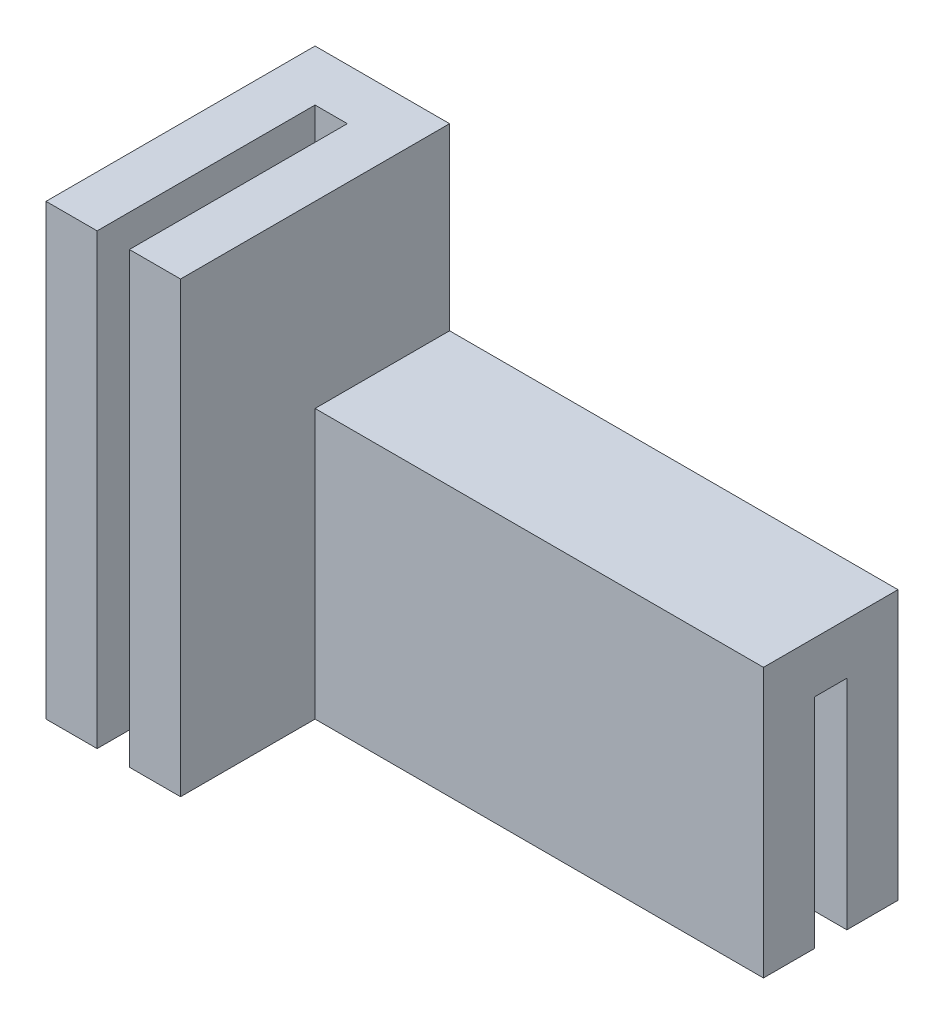
ISO-10303-21;
HEADER;
FILE_DESCRIPTION(('STEP AP214'),'2;1');
FILE_NAME('part.step','',(''),(''),'','','');
FILE_SCHEMA(('AUTOMOTIVE_DESIGN { 1 0 10303 214 1 1 1 1 }'));
ENDSEC;
DATA;
#1=APPLICATION_CONTEXT('core data for automotive mechanical design processes');
#2=APPLICATION_PROTOCOL_DEFINITION('international standard','automotive_design',2000,#1);
#3=PRODUCT_CONTEXT('',#1,'mechanical');
#4=PRODUCT('Part','Part','',(#3));
#5=PRODUCT_RELATED_PRODUCT_CATEGORY('part','',(#4));
#6=PRODUCT_DEFINITION_FORMATION('','',#4);
#7=PRODUCT_DEFINITION_CONTEXT('part definition',#1,'design');
#8=PRODUCT_DEFINITION('design','',#6,#7);
#9=PRODUCT_DEFINITION_SHAPE('','',#8);
#10=(LENGTH_UNIT() NAMED_UNIT(*) SI_UNIT(.MILLI.,.METRE.));
#11=(NAMED_UNIT(*) PLANE_ANGLE_UNIT() SI_UNIT($,.RADIAN.));
#12=(NAMED_UNIT(*) SI_UNIT($,.STERADIAN.) SOLID_ANGLE_UNIT());
#13=UNCERTAINTY_MEASURE_WITH_UNIT(LENGTH_MEASURE(1.E-05),#10,'distance_accuracy_value','');
#14=(GEOMETRIC_REPRESENTATION_CONTEXT(3) GLOBAL_UNCERTAINTY_ASSIGNED_CONTEXT((#13)) GLOBAL_UNIT_ASSIGNED_CONTEXT((#10,
#11,#12)) REPRESENTATION_CONTEXT('',''));
#15=CARTESIAN_POINT('',(0.,0.,0.));
#16=DIRECTION('',(0.,0.,1.));
#17=DIRECTION('',(1.,0.,0.));
#18=AXIS2_PLACEMENT_3D('',#15,#16,#17);
#19=CARTESIAN_POINT('',(15.,0.,30.));
#20=DIRECTION('',(-1.,0.,0.));
#21=DIRECTION('',(0.,-1.,0.));
#22=AXIS2_PLACEMENT_3D('',#19,#20,#21);
#23=PLANE('',#22);
#24=DIRECTION('',(0.,-1.,0.));
#25=VECTOR('',#24,1.);
#26=CARTESIAN_POINT('',(15.,-20.,15.));
#27=LINE('',#26,#25);
#28=CARTESIAN_POINT('',(15.,-20.,15.));
#29=VERTEX_POINT('',#28);
#30=CARTESIAN_POINT('',(15.,-50.,15.));
#31=VERTEX_POINT('',#30);
#32=EDGE_CURVE('E173',#29,#31,#27,.T.);
#33=ORIENTED_EDGE('',*,*,#32,.F.);
#34=DIRECTION('',(0.,0.,1.));
#35=VECTOR('',#34,1.);
#36=CARTESIAN_POINT('',(15.,-20.,0.));
#37=LINE('',#36,#35);
#38=CARTESIAN_POINT('',(15.,-20.,0.));
#39=VERTEX_POINT('',#38);
#40=EDGE_CURVE('E54',#39,#29,#37,.T.);
#41=ORIENTED_EDGE('',*,*,#40,.F.);
#42=DIRECTION('',(0.,1.,0.));
#43=VECTOR('',#42,1.);
#44=CARTESIAN_POINT('',(15.,0.,0.));
#45=LINE('',#44,#43);
#46=CARTESIAN_POINT('',(15.,0.,0.));
#47=VERTEX_POINT('',#46);
#48=EDGE_CURVE('E248',#39,#47,#45,.T.);
#49=ORIENTED_EDGE('',*,*,#48,.T.);
#50=DIRECTION('',(0.,0.,-1.));
#51=VECTOR('',#50,1.);
#52=CARTESIAN_POINT('',(15.,0.,30.));
#53=LINE('',#52,#51);
#54=CARTESIAN_POINT('',(15.,0.,30.));
#55=VERTEX_POINT('',#54);
#56=EDGE_CURVE('E253',#55,#47,#53,.T.);
#57=ORIENTED_EDGE('',*,*,#56,.F.);
#58=DIRECTION('',(0.,1.,0.));
#59=VECTOR('',#58,1.);
#60=CARTESIAN_POINT('',(15.,0.,30.));
#61=LINE('',#60,#59);
#62=CARTESIAN_POINT('',(15.,-50.,30.));
#63=VERTEX_POINT('',#62);
#64=EDGE_CURVE('E237',#63,#55,#61,.T.);
#65=ORIENTED_EDGE('',*,*,#64,.F.);
#66=DIRECTION('',(0.,0.,-1.));
#67=VECTOR('',#66,1.);
#68=CARTESIAN_POINT('',(15.,-50.,30.));
#69=LINE('',#68,#67);
#70=EDGE_CURVE('E42',#63,#31,#69,.T.);
#71=ORIENTED_EDGE('',*,*,#70,.T.);
#72=EDGE_LOOP('',(#33,#41,#49,#57,#65,#71));
#73=FACE_BOUND('',#72,.T.);
#74=ADVANCED_FACE('F34',(#73),#23,.F.);
#75=CARTESIAN_POINT('',(0.,0.,30.));
#76=DIRECTION('',(0.,0.,1.));
#77=DIRECTION('',(1.,0.,0.));
#78=AXIS2_PLACEMENT_3D('',#75,#76,#77);
#79=PLANE('',#78);
#80=DIRECTION('',(0.,-1.,0.));
#81=VECTOR('',#80,1.);
#82=CARTESIAN_POINT('',(5.7,0.,30.));
#83=LINE('',#82,#81);
#84=CARTESIAN_POINT('',(5.7,0.,30.));
#85=VERTEX_POINT('',#84);
#86=CARTESIAN_POINT('',(5.7,-50.,30.));
#87=VERTEX_POINT('',#86);
#88=EDGE_CURVE('E202',#85,#87,#83,.T.);
#89=ORIENTED_EDGE('',*,*,#88,.F.);
#90=DIRECTION('',(-1.,0.,0.));
#91=VECTOR('',#90,1.);
#92=CARTESIAN_POINT('',(0.,0.,30.));
#93=LINE('',#92,#91);
#94=CARTESIAN_POINT('',(0.,0.,30.));
#95=VERTEX_POINT('',#94);
#96=EDGE_CURVE('E239',#85,#95,#93,.T.);
#97=ORIENTED_EDGE('',*,*,#96,.T.);
#98=DIRECTION('',(0.,-1.,0.));
#99=VECTOR('',#98,1.);
#100=CARTESIAN_POINT('',(0.,0.,30.));
#101=LINE('',#100,#99);
#102=CARTESIAN_POINT('',(0.,-50.,30.));
#103=VERTEX_POINT('',#102);
#104=EDGE_CURVE('E229',#95,#103,#101,.T.);
#105=ORIENTED_EDGE('',*,*,#104,.T.);
#106=DIRECTION('',(1.,0.,0.));
#107=VECTOR('',#106,1.);
#108=CARTESIAN_POINT('',(0.,-50.,30.));
#109=LINE('',#108,#107);
#110=EDGE_CURVE('E234',#103,#87,#109,.T.);
#111=ORIENTED_EDGE('',*,*,#110,.T.);
#112=EDGE_LOOP('',(#89,#97,#105,#111));
#113=FACE_BOUND('',#112,.T.);
#114=ADVANCED_FACE('F274',(#113),#79,.T.);
#115=CARTESIAN_POINT('',(0.,0.,30.));
#116=DIRECTION('',(1.,0.,0.));
#117=DIRECTION('',(0.,1.,0.));
#118=AXIS2_PLACEMENT_3D('',#115,#116,#117);
#119=PLANE('',#118);
#120=DIRECTION('',(0.,-1.,0.));
#121=VECTOR('',#120,1.);
#122=CARTESIAN_POINT('',(0.,0.,0.));
#123=LINE('',#122,#121);
#124=CARTESIAN_POINT('',(0.,0.,0.));
#125=VERTEX_POINT('',#124);
#126=CARTESIAN_POINT('',(0.,-50.,0.));
#127=VERTEX_POINT('',#126);
#128=EDGE_CURVE('E221',#125,#127,#123,.T.);
#129=ORIENTED_EDGE('',*,*,#128,.T.);
#130=DIRECTION('',(0.,0.,-1.));
#131=VECTOR('',#130,1.);
#132=CARTESIAN_POINT('',(0.,-50.,30.));
#133=LINE('',#132,#131);
#134=EDGE_CURVE('E11',#103,#127,#133,.T.);
#135=ORIENTED_EDGE('',*,*,#134,.F.);
#136=ORIENTED_EDGE('',*,*,#104,.F.);
#137=DIRECTION('',(0.,0.,-1.));
#138=VECTOR('',#137,1.);
#139=CARTESIAN_POINT('',(0.,0.,30.));
#140=LINE('',#139,#138);
#141=EDGE_CURVE('E243',#95,#125,#140,.T.);
#142=ORIENTED_EDGE('',*,*,#141,.T.);
#143=EDGE_LOOP('',(#129,#135,#136,#142));
#144=FACE_BOUND('',#143,.T.);
#145=ADVANCED_FACE('F36',(#144),#119,.F.);
#146=CARTESIAN_POINT('',(0.,-50.,30.));
#147=DIRECTION('',(0.,1.,0.));
#148=DIRECTION('',(0.,0.,1.));
#149=AXIS2_PLACEMENT_3D('',#146,#147,#148);
#150=PLANE('',#149);
#151=DIRECTION('',(0.,0.,-1.));
#152=VECTOR('',#151,1.);
#153=CARTESIAN_POINT('',(13.,-50.,9.3));
#154=LINE('',#153,#152);
#155=CARTESIAN_POINT('',(13.,-50.,9.3));
#156=VERTEX_POINT('',#155);
#157=CARTESIAN_POINT('',(13.,-50.,5.7));
#158=VERTEX_POINT('',#157);
#159=EDGE_CURVE('E146',#156,#158,#154,.T.);
#160=ORIENTED_EDGE('',*,*,#159,.F.);
#161=DIRECTION('',(-1.,0.,0.));
#162=VECTOR('',#161,1.);
#163=CARTESIAN_POINT('',(65.,-50.,9.3));
#164=LINE('',#163,#162);
#165=CARTESIAN_POINT('',(65.,-50.,9.3));
#166=VERTEX_POINT('',#165);
#167=EDGE_CURVE('E191',#166,#156,#164,.T.);
#168=ORIENTED_EDGE('',*,*,#167,.F.);
#169=DIRECTION('',(0.,0.,-1.));
#170=VECTOR('',#169,1.);
#171=CARTESIAN_POINT('',(65.,-50.,15.));
#172=LINE('',#171,#170);
#173=CARTESIAN_POINT('',(65.,-50.,15.));
#174=VERTEX_POINT('',#173);
#175=EDGE_CURVE('E179',#174,#166,#172,.T.);
#176=ORIENTED_EDGE('',*,*,#175,.F.);
#177=DIRECTION('',(-1.,0.,0.));
#178=VECTOR('',#177,1.);
#179=CARTESIAN_POINT('',(65.,-50.,15.));
#180=LINE('',#179,#178);
#181=EDGE_CURVE('E193',#174,#31,#180,.T.);
#182=ORIENTED_EDGE('',*,*,#181,.T.);
#183=ORIENTED_EDGE('',*,*,#70,.F.);
#184=CARTESIAN_POINT('',(9.29999999999999,-50.,30.));
#185=VERTEX_POINT('',#184);
#186=EDGE_CURVE('E232',#185,#63,#109,.T.);
#187=ORIENTED_EDGE('',*,*,#186,.F.);
#188=DIRECTION('',(0.,0.,1.));
#189=VECTOR('',#188,1.);
#190=CARTESIAN_POINT('',(9.3,-50.,5.7));
#191=LINE('',#190,#189);
#192=CARTESIAN_POINT('',(9.3,-50.,5.7));
#193=VERTEX_POINT('',#192);
#194=EDGE_CURVE('E225',#193,#185,#191,.T.);
#195=ORIENTED_EDGE('',*,*,#194,.F.);
#196=DIRECTION('',(1.,0.,0.));
#197=VECTOR('',#196,1.);
#198=CARTESIAN_POINT('',(5.7,-50.,5.7));
#199=LINE('',#198,#197);
#200=CARTESIAN_POINT('',(5.7,-50.,5.7));
#201=VERTEX_POINT('',#200);
#202=EDGE_CURVE('E206',#201,#193,#199,.T.);
#203=ORIENTED_EDGE('',*,*,#202,.F.);
#204=DIRECTION('',(0.,0.,1.));
#205=VECTOR('',#204,1.);
#206=CARTESIAN_POINT('',(5.7,-50.,5.7));
#207=LINE('',#206,#205);
#208=EDGE_CURVE('E216',#201,#87,#207,.T.);
#209=ORIENTED_EDGE('',*,*,#208,.T.);
#210=ORIENTED_EDGE('',*,*,#110,.F.);
#211=ORIENTED_EDGE('',*,*,#134,.T.);
#212=DIRECTION('',(1.,0.,0.));
#213=VECTOR('',#212,1.);
#214=CARTESIAN_POINT('',(0.,-50.,0.));
#215=LINE('',#214,#213);
#216=CARTESIAN_POINT('',(65.,-50.,0.));
#217=VERTEX_POINT('',#216);
#218=EDGE_CURVE('E246',#127,#217,#215,.T.);
#219=ORIENTED_EDGE('',*,*,#218,.T.);
#220=DIRECTION('',(0.,0.,-1.));
#221=VECTOR('',#220,1.);
#222=CARTESIAN_POINT('',(65.,-50.,0.));
#223=LINE('',#222,#221);
#224=CARTESIAN_POINT('',(65.,-50.,5.7));
#225=VERTEX_POINT('',#224);
#226=EDGE_CURVE('E148',#225,#217,#223,.T.);
#227=ORIENTED_EDGE('',*,*,#226,.F.);
#228=DIRECTION('',(-1.,0.,0.));
#229=VECTOR('',#228,1.);
#230=CARTESIAN_POINT('',(65.,-50.,5.7));
#231=LINE('',#230,#229);
#232=EDGE_CURVE('E141',#225,#158,#231,.T.);
#233=ORIENTED_EDGE('',*,*,#232,.T.);
#234=EDGE_LOOP('',(#160,#168,#176,#182,#183,#187,#195,#203,#209,#210,#211,#219,#227,#233));
#235=FACE_BOUND('',#234,.T.);
#236=ADVANCED_FACE('F143',(#235),#150,.F.);
#237=CARTESIAN_POINT('',(0.,0.,30.));
#238=DIRECTION('',(0.,-1.,0.));
#239=DIRECTION('',(0.,0.,-1.));
#240=AXIS2_PLACEMENT_3D('',#237,#238,#239);
#241=PLANE('',#240);
#242=ORIENTED_EDGE('',*,*,#96,.F.);
#243=DIRECTION('',(0.,0.,1.));
#244=VECTOR('',#243,1.);
#245=CARTESIAN_POINT('',(5.7,0.,5.7));
#246=LINE('',#245,#244);
#247=CARTESIAN_POINT('',(5.7,0.,5.7));
#248=VERTEX_POINT('',#247);
#249=EDGE_CURVE('E219',#248,#85,#246,.T.);
#250=ORIENTED_EDGE('',*,*,#249,.F.);
#251=DIRECTION('',(-1.,0.,0.));
#252=VECTOR('',#251,1.);
#253=CARTESIAN_POINT('',(5.7,0.,5.7));
#254=LINE('',#253,#252);
#255=CARTESIAN_POINT('',(9.3,0.,5.7));
#256=VERTEX_POINT('',#255);
#257=EDGE_CURVE('E213',#256,#248,#254,.T.);
#258=ORIENTED_EDGE('',*,*,#257,.F.);
#259=DIRECTION('',(0.,0.,1.));
#260=VECTOR('',#259,1.);
#261=CARTESIAN_POINT('',(9.3,0.,5.7));
#262=LINE('',#261,#260);
#263=CARTESIAN_POINT('',(9.3,0.,30.));
#264=VERTEX_POINT('',#263);
#265=EDGE_CURVE('E222',#256,#264,#262,.T.);
#266=ORIENTED_EDGE('',*,*,#265,.T.);
#267=EDGE_CURVE('E240',#55,#264,#93,.T.);
#268=ORIENTED_EDGE('',*,*,#267,.F.);
#269=ORIENTED_EDGE('',*,*,#56,.T.);
#270=DIRECTION('',(-1.,0.,0.));
#271=VECTOR('',#270,1.);
#272=CARTESIAN_POINT('',(0.,0.,0.));
#273=LINE('',#272,#271);
#274=EDGE_CURVE('E233',#47,#125,#273,.T.);
#275=ORIENTED_EDGE('',*,*,#274,.T.);
#276=ORIENTED_EDGE('',*,*,#141,.F.);
#277=EDGE_LOOP('',(#242,#250,#258,#266,#268,#269,#275,#276));
#278=FACE_BOUND('',#277,.T.);
#279=ADVANCED_FACE('F260',(#278),#241,.F.);
#280=DIRECTION('',(0.,1.,0.));
#281=VECTOR('',#280,1.);
#282=CARTESIAN_POINT('',(9.3,0.,30.));
#283=LINE('',#282,#281);
#284=EDGE_CURVE('E207',#185,#264,#283,.T.);
#285=ORIENTED_EDGE('',*,*,#284,.F.);
#286=ORIENTED_EDGE('',*,*,#186,.T.);
#287=ORIENTED_EDGE('',*,*,#64,.T.);
#288=ORIENTED_EDGE('',*,*,#267,.T.);
#289=EDGE_LOOP('',(#285,#286,#287,#288));
#290=FACE_BOUND('',#289,.T.);
#291=ADVANCED_FACE('F285',(#290),#79,.T.);
#292=CARTESIAN_POINT('',(0.,0.,0.));
#293=DIRECTION('',(0.,0.,1.));
#294=DIRECTION('',(1.,0.,0.));
#295=AXIS2_PLACEMENT_3D('',#292,#293,#294);
#296=PLANE('',#295);
#297=ORIENTED_EDGE('',*,*,#128,.F.);
#298=ORIENTED_EDGE('',*,*,#274,.F.);
#299=ORIENTED_EDGE('',*,*,#48,.F.);
#300=DIRECTION('',(-1.,0.,0.));
#301=VECTOR('',#300,1.);
#302=CARTESIAN_POINT('',(65.,-20.,0.));
#303=LINE('',#302,#301);
#304=CARTESIAN_POINT('',(65.,-20.,0.));
#305=VERTEX_POINT('',#304);
#306=EDGE_CURVE('E199',#305,#39,#303,.T.);
#307=ORIENTED_EDGE('',*,*,#306,.F.);
#308=DIRECTION('',(0.,1.,0.));
#309=VECTOR('',#308,1.);
#310=CARTESIAN_POINT('',(65.,-50.,0.));
#311=LINE('',#310,#309);
#312=EDGE_CURVE('E172',#217,#305,#311,.T.);
#313=ORIENTED_EDGE('',*,*,#312,.F.);
#314=ORIENTED_EDGE('',*,*,#218,.F.);
#315=EDGE_LOOP('',(#297,#298,#299,#307,#313,#314));
#316=FACE_BOUND('',#315,.T.);
#317=ADVANCED_FACE('F264',(#316),#296,.F.);
#318=CARTESIAN_POINT('',(5.7,0.,5.7));
#319=DIRECTION('',(-1.,0.,0.));
#320=DIRECTION('',(0.,0.,1.));
#321=AXIS2_PLACEMENT_3D('',#318,#319,#320);
#322=PLANE('',#321);
#323=ORIENTED_EDGE('',*,*,#88,.T.);
#324=ORIENTED_EDGE('',*,*,#208,.F.);
#325=DIRECTION('',(0.,-1.,0.));
#326=VECTOR('',#325,1.);
#327=CARTESIAN_POINT('',(5.7,0.,5.7));
#328=LINE('',#327,#326);
#329=EDGE_CURVE('E203',#248,#201,#328,.T.);
#330=ORIENTED_EDGE('',*,*,#329,.F.);
#331=ORIENTED_EDGE('',*,*,#249,.T.);
#332=EDGE_LOOP('',(#323,#324,#330,#331));
#333=FACE_BOUND('',#332,.T.);
#334=ADVANCED_FACE('F276',(#333),#322,.F.);
#335=CARTESIAN_POINT('',(9.3,0.,5.7));
#336=DIRECTION('',(1.,0.,0.));
#337=DIRECTION('',(0.,0.,-1.));
#338=AXIS2_PLACEMENT_3D('',#335,#336,#337);
#339=PLANE('',#338);
#340=ORIENTED_EDGE('',*,*,#284,.T.);
#341=ORIENTED_EDGE('',*,*,#265,.F.);
#342=DIRECTION('',(0.,1.,0.));
#343=VECTOR('',#342,1.);
#344=CARTESIAN_POINT('',(9.3,0.,5.7));
#345=LINE('',#344,#343);
#346=EDGE_CURVE('E210',#193,#256,#345,.T.);
#347=ORIENTED_EDGE('',*,*,#346,.F.);
#348=ORIENTED_EDGE('',*,*,#194,.T.);
#349=EDGE_LOOP('',(#340,#341,#347,#348));
#350=FACE_BOUND('',#349,.T.);
#351=ADVANCED_FACE('F331',(#350),#339,.F.);
#352=CARTESIAN_POINT('',(0.,0.,5.7));
#353=DIRECTION('',(0.,0.,1.));
#354=DIRECTION('',(1.,0.,0.));
#355=AXIS2_PLACEMENT_3D('',#352,#353,#354);
#356=PLANE('',#355);
#357=ORIENTED_EDGE('',*,*,#329,.T.);
#358=ORIENTED_EDGE('',*,*,#202,.T.);
#359=ORIENTED_EDGE('',*,*,#346,.T.);
#360=ORIENTED_EDGE('',*,*,#257,.T.);
#361=EDGE_LOOP('',(#357,#358,#359,#360));
#362=FACE_BOUND('',#361,.T.);
#363=ADVANCED_FACE('F281',(#362),#356,.T.);
#364=CARTESIAN_POINT('',(65.,-20.,0.));
#365=DIRECTION('',(0.,-1.,0.));
#366=DIRECTION('',(0.,0.,-1.));
#367=AXIS2_PLACEMENT_3D('',#364,#365,#366);
#368=PLANE('',#367);
#369=ORIENTED_EDGE('',*,*,#40,.T.);
#370=DIRECTION('',(-1.,0.,0.));
#371=VECTOR('',#370,1.);
#372=CARTESIAN_POINT('',(65.,-20.,15.));
#373=LINE('',#372,#371);
#374=CARTESIAN_POINT('',(65.,-20.,15.));
#375=VERTEX_POINT('',#374);
#376=EDGE_CURVE('E196',#375,#29,#373,.T.);
#377=ORIENTED_EDGE('',*,*,#376,.F.);
#378=DIRECTION('',(0.,0.,1.));
#379=VECTOR('',#378,1.);
#380=CARTESIAN_POINT('',(65.,-20.,0.));
#381=LINE('',#380,#379);
#382=EDGE_CURVE('E175',#305,#375,#381,.T.);
#383=ORIENTED_EDGE('',*,*,#382,.F.);
#384=ORIENTED_EDGE('',*,*,#306,.T.);
#385=EDGE_LOOP('',(#369,#377,#383,#384));
#386=FACE_BOUND('',#385,.T.);
#387=ADVANCED_FACE('F344',(#386),#368,.F.);
#388=CARTESIAN_POINT('',(65.,-20.,15.));
#389=DIRECTION('',(0.,0.,-1.));
#390=DIRECTION('',(-1.,0.,0.));
#391=AXIS2_PLACEMENT_3D('',#388,#389,#390);
#392=PLANE('',#391);
#393=ORIENTED_EDGE('',*,*,#32,.T.);
#394=ORIENTED_EDGE('',*,*,#181,.F.);
#395=DIRECTION('',(0.,-1.,0.));
#396=VECTOR('',#395,1.);
#397=CARTESIAN_POINT('',(65.,-20.,15.));
#398=LINE('',#397,#396);
#399=EDGE_CURVE('E177',#375,#174,#398,.T.);
#400=ORIENTED_EDGE('',*,*,#399,.F.);
#401=ORIENTED_EDGE('',*,*,#376,.T.);
#402=EDGE_LOOP('',(#393,#394,#400,#401));
#403=FACE_BOUND('',#402,.T.);
#404=ADVANCED_FACE('F350',(#403),#392,.F.);
#405=CARTESIAN_POINT('',(65.,-50.,9.3));
#406=DIRECTION('',(0.,0.,1.));
#407=DIRECTION('',(1.,0.,0.));
#408=AXIS2_PLACEMENT_3D('',#405,#406,#407);
#409=PLANE('',#408);
#410=ORIENTED_EDGE('',*,*,#167,.T.);
#411=DIRECTION('',(0.,-1.,0.));
#412=VECTOR('',#411,1.);
#413=CARTESIAN_POINT('',(13.,-25.7,9.3));
#414=LINE('',#413,#412);
#415=CARTESIAN_POINT('',(13.,-25.7,9.3));
#416=VERTEX_POINT('',#415);
#417=EDGE_CURVE('E166',#416,#156,#414,.T.);
#418=ORIENTED_EDGE('',*,*,#417,.F.);
#419=DIRECTION('',(-1.,0.,0.));
#420=VECTOR('',#419,1.);
#421=CARTESIAN_POINT('',(65.,-25.7,9.3));
#422=LINE('',#421,#420);
#423=CARTESIAN_POINT('',(65.,-25.7,9.3));
#424=VERTEX_POINT('',#423);
#425=EDGE_CURVE('E189',#424,#416,#422,.T.);
#426=ORIENTED_EDGE('',*,*,#425,.F.);
#427=DIRECTION('',(0.,1.,0.));
#428=VECTOR('',#427,1.);
#429=CARTESIAN_POINT('',(65.,-50.,9.3));
#430=LINE('',#429,#428);
#431=EDGE_CURVE('E181',#166,#424,#430,.T.);
#432=ORIENTED_EDGE('',*,*,#431,.F.);
#433=EDGE_LOOP('',(#410,#418,#426,#432));
#434=FACE_BOUND('',#433,.T.);
#435=ADVANCED_FACE('F358',(#434),#409,.F.);
#436=CARTESIAN_POINT('',(65.,-25.7,9.3));
#437=DIRECTION('',(0.,1.,0.));
#438=DIRECTION('',(-1.,0.,0.));
#439=AXIS2_PLACEMENT_3D('',#436,#437,#438);
#440=PLANE('',#439);
#441=ORIENTED_EDGE('',*,*,#425,.T.);
#442=DIRECTION('',(0.,0.,1.));
#443=VECTOR('',#442,1.);
#444=CARTESIAN_POINT('',(13.,-25.7,5.7));
#445=LINE('',#444,#443);
#446=CARTESIAN_POINT('',(13.,-25.7,5.7));
#447=VERTEX_POINT('',#446);
#448=EDGE_CURVE('E161',#447,#416,#445,.T.);
#449=ORIENTED_EDGE('',*,*,#448,.F.);
#450=DIRECTION('',(-1.,0.,0.));
#451=VECTOR('',#450,1.);
#452=CARTESIAN_POINT('',(65.,-25.7,5.7));
#453=LINE('',#452,#451);
#454=CARTESIAN_POINT('',(65.,-25.7,5.7));
#455=VERTEX_POINT('',#454);
#456=EDGE_CURVE('E151',#455,#447,#453,.T.);
#457=ORIENTED_EDGE('',*,*,#456,.F.);
#458=DIRECTION('',(0.,0.,-1.));
#459=VECTOR('',#458,1.);
#460=CARTESIAN_POINT('',(65.,-25.7,9.3));
#461=LINE('',#460,#459);
#462=EDGE_CURVE('E183',#424,#455,#461,.T.);
#463=ORIENTED_EDGE('',*,*,#462,.F.);
#464=EDGE_LOOP('',(#441,#449,#457,#463));
#465=FACE_BOUND('',#464,.T.);
#466=ADVANCED_FACE('F372',(#465),#440,.F.);
#467=CARTESIAN_POINT('',(65.,-25.7,5.7));
#468=DIRECTION('',(0.,0.,-1.));
#469=DIRECTION('',(-1.,0.,0.));
#470=AXIS2_PLACEMENT_3D('',#467,#468,#469);
#471=PLANE('',#470);
#472=ORIENTED_EDGE('',*,*,#456,.T.);
#473=DIRECTION('',(0.,1.,0.));
#474=VECTOR('',#473,1.);
#475=CARTESIAN_POINT('',(13.,-50.,5.7));
#476=LINE('',#475,#474);
#477=EDGE_CURVE('E155',#158,#447,#476,.T.);
#478=ORIENTED_EDGE('',*,*,#477,.F.);
#479=ORIENTED_EDGE('',*,*,#232,.F.);
#480=DIRECTION('',(0.,-1.,0.));
#481=VECTOR('',#480,1.);
#482=CARTESIAN_POINT('',(65.,-25.7,5.7));
#483=LINE('',#482,#481);
#484=EDGE_CURVE('E152',#455,#225,#483,.T.);
#485=ORIENTED_EDGE('',*,*,#484,.F.);
#486=EDGE_LOOP('',(#472,#478,#479,#485));
#487=FACE_BOUND('',#486,.T.);
#488=ADVANCED_FACE('F156',(#487),#471,.F.);
#489=CARTESIAN_POINT('',(65.,0.,0.));
#490=DIRECTION('',(1.,0.,0.));
#491=DIRECTION('',(0.,1.,0.));
#492=AXIS2_PLACEMENT_3D('',#489,#490,#491);
#493=PLANE('',#492);
#494=ORIENTED_EDGE('',*,*,#226,.T.);
#495=ORIENTED_EDGE('',*,*,#312,.T.);
#496=ORIENTED_EDGE('',*,*,#382,.T.);
#497=ORIENTED_EDGE('',*,*,#399,.T.);
#498=ORIENTED_EDGE('',*,*,#175,.T.);
#499=ORIENTED_EDGE('',*,*,#431,.T.);
#500=ORIENTED_EDGE('',*,*,#462,.T.);
#501=ORIENTED_EDGE('',*,*,#484,.T.);
#502=EDGE_LOOP('',(#494,#495,#496,#497,#498,#499,#500,#501));
#503=FACE_BOUND('',#502,.T.);
#504=ADVANCED_FACE('F363',(#503),#493,.T.);
#505=CARTESIAN_POINT('',(13.,0.,0.));
#506=DIRECTION('',(1.,0.,0.));
#507=DIRECTION('',(0.,1.,0.));
#508=AXIS2_PLACEMENT_3D('',#505,#506,#507);
#509=PLANE('',#508);
#510=ORIENTED_EDGE('',*,*,#159,.T.);
#511=ORIENTED_EDGE('',*,*,#477,.T.);
#512=ORIENTED_EDGE('',*,*,#448,.T.);
#513=ORIENTED_EDGE('',*,*,#417,.T.);
#514=EDGE_LOOP('',(#510,#511,#512,#513));
#515=FACE_BOUND('',#514,.T.);
#516=ADVANCED_FACE('F164',(#515),#509,.T.);
#517=CLOSED_SHELL('',(#74,#114,#145,#236,#279,#291,#317,#334,#351,#363,#387,#404,#435,#466,#488,
#504,#516));
#518=MANIFOLD_SOLID_BREP('B2',#517);
#519=ADVANCED_BREP_SHAPE_REPRESENTATION('',(#18,#518),#14);
#520=SHAPE_DEFINITION_REPRESENTATION(#9,#519);
ENDSEC;
END-ISO-10303-21;
